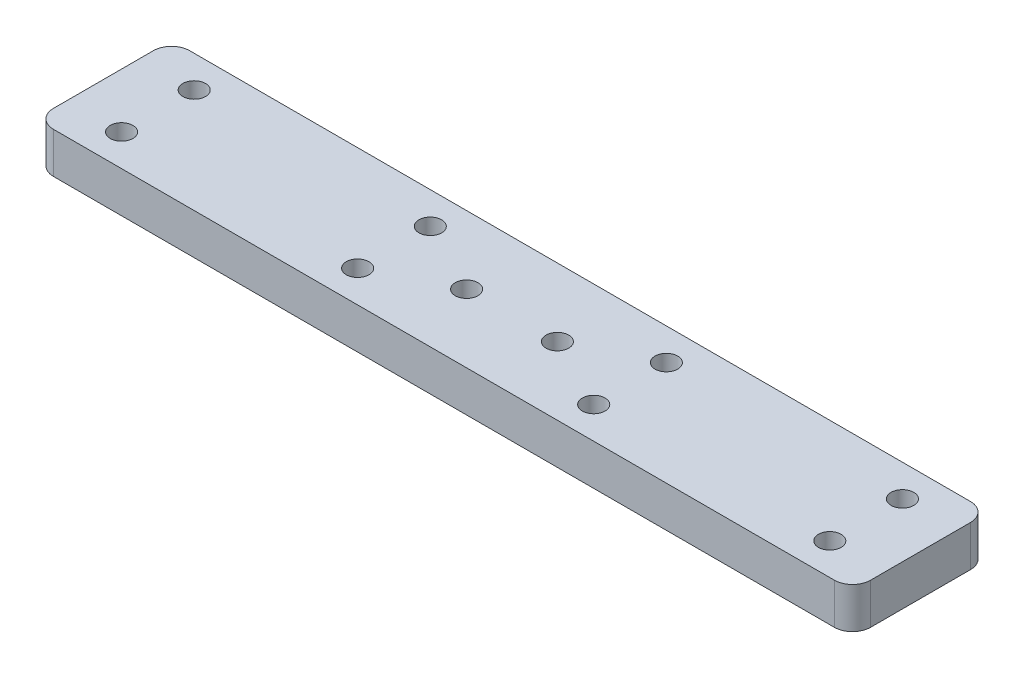
ISO-10303-21;
HEADER;
FILE_DESCRIPTION(('STEP AP214'),'2;1');
FILE_NAME('part.step','',(''),(''),'','','');
FILE_SCHEMA(('AUTOMOTIVE_DESIGN { 1 0 10303 214 1 1 1 1 }'));
ENDSEC;
DATA;
#1=APPLICATION_CONTEXT('core data for automotive mechanical design processes');
#2=APPLICATION_PROTOCOL_DEFINITION('international standard','automotive_design',2000,#1);
#3=PRODUCT_CONTEXT('',#1,'mechanical');
#4=PRODUCT('Part','Part','',(#3));
#5=PRODUCT_RELATED_PRODUCT_CATEGORY('part','',(#4));
#6=PRODUCT_DEFINITION_FORMATION('','',#4);
#7=PRODUCT_DEFINITION_CONTEXT('part definition',#1,'design');
#8=PRODUCT_DEFINITION('design','',#6,#7);
#9=PRODUCT_DEFINITION_SHAPE('','',#8);
#10=(LENGTH_UNIT() NAMED_UNIT(*) SI_UNIT(.MILLI.,.METRE.));
#11=(NAMED_UNIT(*) PLANE_ANGLE_UNIT() SI_UNIT($,.RADIAN.));
#12=(NAMED_UNIT(*) SI_UNIT($,.STERADIAN.) SOLID_ANGLE_UNIT());
#13=UNCERTAINTY_MEASURE_WITH_UNIT(LENGTH_MEASURE(1.E-05),#10,'distance_accuracy_value','');
#14=(GEOMETRIC_REPRESENTATION_CONTEXT(3) GLOBAL_UNCERTAINTY_ASSIGNED_CONTEXT((#13)) GLOBAL_UNIT_ASSIGNED_CONTEXT((#10,
#11,#12)) REPRESENTATION_CONTEXT('',''));
#15=CARTESIAN_POINT('',(0.,0.,0.));
#16=DIRECTION('',(0.,0.,1.));
#17=DIRECTION('',(1.,0.,0.));
#18=AXIS2_PLACEMENT_3D('',#15,#16,#17);
#19=CARTESIAN_POINT('',(43.,4.5,-5.5));
#20=DIRECTION('',(0.,1.,0.));
#21=DIRECTION('',(0.,0.,1.));
#22=AXIS2_PLACEMENT_3D('',#19,#20,#21);
#23=PLANE('',#22);
#24=CARTESIAN_POINT('',(39.,4.5,-3.99999999999999));
#25=DIRECTION('',(0.,1.,0.));
#26=DIRECTION('',(0.,0.,1.));
#27=AXIS2_PLACEMENT_3D('',#24,#25,#26);
#28=CIRCLE('',#27,1.25);
#29=CARTESIAN_POINT('',(39.,4.5,-2.75));
#30=VERTEX_POINT('',#29);
#31=EDGE_CURVE('E228',#30,#30,#28,.T.);
#32=ORIENTED_EDGE('',*,*,#31,.F.);
#33=EDGE_LOOP('',(#32));
#34=FACE_BOUND('',#33,.T.);
#35=CARTESIAN_POINT('',(13.,4.5,-3.99999999999999));
#36=DIRECTION('',(0.,1.,0.));
#37=DIRECTION('',(0.,0.,1.));
#38=AXIS2_PLACEMENT_3D('',#35,#36,#37);
#39=CIRCLE('',#38,1.25);
#40=CARTESIAN_POINT('',(13.,4.5,-2.75));
#41=VERTEX_POINT('',#40);
#42=EDGE_CURVE('E216',#41,#41,#39,.T.);
#43=ORIENTED_EDGE('',*,*,#42,.F.);
#44=EDGE_LOOP('',(#43));
#45=FACE_BOUND('',#44,.T.);
#46=CARTESIAN_POINT('',(-39.,4.5,4.00000000000001));
#47=DIRECTION('',(0.,1.,0.));
#48=DIRECTION('',(0.,0.,1.));
#49=AXIS2_PLACEMENT_3D('',#46,#47,#48);
#50=CIRCLE('',#49,1.25);
#51=CARTESIAN_POINT('',(-39.,4.5,5.25));
#52=VERTEX_POINT('',#51);
#53=EDGE_CURVE('E204',#52,#52,#50,.T.);
#54=ORIENTED_EDGE('',*,*,#53,.F.);
#55=EDGE_LOOP('',(#54));
#56=FACE_BOUND('',#55,.T.);
#57=CARTESIAN_POINT('',(5.,4.5,0.));
#58=DIRECTION('',(0.,1.,0.));
#59=DIRECTION('',(0.,0.,1.));
#60=AXIS2_PLACEMENT_3D('',#57,#58,#59);
#61=CIRCLE('',#60,1.25);
#62=CARTESIAN_POINT('',(5.,4.5,1.25));
#63=VERTEX_POINT('',#62);
#64=EDGE_CURVE('E192',#63,#63,#61,.T.);
#65=ORIENTED_EDGE('',*,*,#64,.F.);
#66=EDGE_LOOP('',(#65));
#67=FACE_BOUND('',#66,.T.);
#68=CARTESIAN_POINT('',(-5.,4.5,0.));
#69=DIRECTION('',(0.,1.,0.));
#70=DIRECTION('',(0.,0.,1.));
#71=AXIS2_PLACEMENT_3D('',#68,#69,#70);
#72=CIRCLE('',#71,1.25);
#73=CARTESIAN_POINT('',(-5.,4.5,1.25));
#74=VERTEX_POINT('',#73);
#75=EDGE_CURVE('E138',#74,#74,#72,.T.);
#76=ORIENTED_EDGE('',*,*,#75,.F.);
#77=EDGE_LOOP('',(#76));
#78=FACE_BOUND('',#77,.T.);
#79=CARTESIAN_POINT('',(43.,4.5,-5.5));
#80=DIRECTION('',(0.,1.,0.));
#81=DIRECTION('',(0.,0.,1.));
#82=AXIS2_PLACEMENT_3D('',#79,#80,#81);
#83=CIRCLE('',#82,2.);
#84=CARTESIAN_POINT('',(45.,4.5,-5.49999999999999));
#85=VERTEX_POINT('',#84);
#86=CARTESIAN_POINT('',(43.,4.5,-7.5));
#87=VERTEX_POINT('',#86);
#88=EDGE_CURVE('E149',#85,#87,#83,.T.);
#89=ORIENTED_EDGE('',*,*,#88,.T.);
#90=DIRECTION('',(-1.,0.,0.));
#91=VECTOR('',#90,1.);
#92=CARTESIAN_POINT('',(-43.,4.5,-7.5));
#93=LINE('',#92,#91);
#94=CARTESIAN_POINT('',(-43.,4.5,-7.5));
#95=VERTEX_POINT('',#94);
#96=EDGE_CURVE('E97',#87,#95,#93,.T.);
#97=ORIENTED_EDGE('',*,*,#96,.T.);
#98=CARTESIAN_POINT('',(-43.,4.5,-5.5));
#99=DIRECTION('',(0.,1.,0.));
#100=DIRECTION('',(0.,0.,-1.));
#101=AXIS2_PLACEMENT_3D('',#98,#99,#100);
#102=CIRCLE('',#101,2.);
#103=CARTESIAN_POINT('',(-45.,4.5,-5.49999999999999));
#104=VERTEX_POINT('',#103);
#105=EDGE_CURVE('E164',#95,#104,#102,.T.);
#106=ORIENTED_EDGE('',*,*,#105,.T.);
#107=DIRECTION('',(0.,0.,1.));
#108=VECTOR('',#107,1.);
#109=CARTESIAN_POINT('',(-45.,4.5,-5.49999999999999));
#110=LINE('',#109,#108);
#111=CARTESIAN_POINT('',(-45.,4.5,5.49999999999998));
#112=VERTEX_POINT('',#111);
#113=EDGE_CURVE('E177',#104,#112,#110,.T.);
#114=ORIENTED_EDGE('',*,*,#113,.T.);
#115=CARTESIAN_POINT('',(-43.,4.5,5.5));
#116=DIRECTION('',(0.,1.,0.));
#117=DIRECTION('',(0.,0.,1.));
#118=AXIS2_PLACEMENT_3D('',#115,#116,#117);
#119=CIRCLE('',#118,2.);
#120=CARTESIAN_POINT('',(-43.,4.5,7.5));
#121=VERTEX_POINT('',#120);
#122=EDGE_CURVE('E116',#112,#121,#119,.T.);
#123=ORIENTED_EDGE('',*,*,#122,.T.);
#124=DIRECTION('',(1.,0.,0.));
#125=VECTOR('',#124,1.);
#126=CARTESIAN_POINT('',(-43.,4.5,7.5));
#127=LINE('',#126,#125);
#128=CARTESIAN_POINT('',(43.,4.5,7.5));
#129=VERTEX_POINT('',#128);
#130=EDGE_CURVE('E110',#121,#129,#127,.T.);
#131=ORIENTED_EDGE('',*,*,#130,.T.);
#132=CARTESIAN_POINT('',(43.,4.5,5.5));
#133=DIRECTION('',(0.,1.,0.));
#134=DIRECTION('',(0.,0.,-1.));
#135=AXIS2_PLACEMENT_3D('',#132,#133,#134);
#136=CIRCLE('',#135,2.);
#137=CARTESIAN_POINT('',(45.,4.5,5.49999999999999));
#138=VERTEX_POINT('',#137);
#139=EDGE_CURVE('E114',#129,#138,#136,.T.);
#140=ORIENTED_EDGE('',*,*,#139,.T.);
#141=DIRECTION('',(0.,0.,-1.));
#142=VECTOR('',#141,1.);
#143=CARTESIAN_POINT('',(45.,4.5,-5.49999999999999));
#144=LINE('',#143,#142);
#145=EDGE_CURVE('E54',#138,#85,#144,.T.);
#146=ORIENTED_EDGE('',*,*,#145,.T.);
#147=EDGE_LOOP('',(#89,#97,#106,#114,#123,#131,#140,#146));
#148=FACE_BOUND('',#147,.T.);
#149=CARTESIAN_POINT('',(-39.,4.5,-3.99999999999999));
#150=DIRECTION('',(0.,1.,0.));
#151=DIRECTION('',(0.,0.,1.));
#152=AXIS2_PLACEMENT_3D('',#149,#150,#151);
#153=CIRCLE('',#152,1.25);
#154=CARTESIAN_POINT('',(-39.,4.5,-2.75));
#155=VERTEX_POINT('',#154);
#156=EDGE_CURVE('E186',#155,#155,#153,.T.);
#157=ORIENTED_EDGE('',*,*,#156,.F.);
#158=EDGE_LOOP('',(#157));
#159=FACE_BOUND('',#158,.T.);
#160=CARTESIAN_POINT('',(-13.,4.5,-3.99999999999999));
#161=DIRECTION('',(0.,1.,0.));
#162=DIRECTION('',(0.,0.,1.));
#163=AXIS2_PLACEMENT_3D('',#160,#161,#162);
#164=CIRCLE('',#163,1.25);
#165=CARTESIAN_POINT('',(-13.,4.5,-2.75));
#166=VERTEX_POINT('',#165);
#167=EDGE_CURVE('E198',#166,#166,#164,.T.);
#168=ORIENTED_EDGE('',*,*,#167,.F.);
#169=EDGE_LOOP('',(#168));
#170=FACE_BOUND('',#169,.T.);
#171=CARTESIAN_POINT('',(-13.,4.5,4.00000000000001));
#172=DIRECTION('',(0.,1.,0.));
#173=DIRECTION('',(0.,0.,1.));
#174=AXIS2_PLACEMENT_3D('',#171,#172,#173);
#175=CIRCLE('',#174,1.25);
#176=CARTESIAN_POINT('',(-13.,4.5,5.25));
#177=VERTEX_POINT('',#176);
#178=EDGE_CURVE('E210',#177,#177,#175,.T.);
#179=ORIENTED_EDGE('',*,*,#178,.F.);
#180=EDGE_LOOP('',(#179));
#181=FACE_BOUND('',#180,.T.);
#182=CARTESIAN_POINT('',(13.,4.5,4.00000000000001));
#183=DIRECTION('',(0.,1.,0.));
#184=DIRECTION('',(0.,0.,1.));
#185=AXIS2_PLACEMENT_3D('',#182,#183,#184);
#186=CIRCLE('',#185,1.25);
#187=CARTESIAN_POINT('',(13.,4.5,5.25));
#188=VERTEX_POINT('',#187);
#189=EDGE_CURVE('E222',#188,#188,#186,.T.);
#190=ORIENTED_EDGE('',*,*,#189,.F.);
#191=EDGE_LOOP('',(#190));
#192=FACE_BOUND('',#191,.T.);
#193=CARTESIAN_POINT('',(39.,4.5,4.00000000000001));
#194=DIRECTION('',(0.,1.,0.));
#195=DIRECTION('',(0.,0.,1.));
#196=AXIS2_PLACEMENT_3D('',#193,#194,#195);
#197=CIRCLE('',#196,1.25);
#198=CARTESIAN_POINT('',(39.,4.5,5.25));
#199=VERTEX_POINT('',#198);
#200=EDGE_CURVE('E234',#199,#199,#197,.T.);
#201=ORIENTED_EDGE('',*,*,#200,.F.);
#202=EDGE_LOOP('',(#201));
#203=FACE_BOUND('',#202,.T.);
#204=ADVANCED_FACE('F37',(#34,#45,#56,#67,#78,#148,#159,#170,#181,#192,#203),#23,.T.);
#205=CARTESIAN_POINT('',(43.,0.,-5.5));
#206=DIRECTION('',(0.,1.,0.));
#207=DIRECTION('',(0.,0.,1.));
#208=AXIS2_PLACEMENT_3D('',#205,#206,#207);
#209=PLANE('',#208);
#210=CARTESIAN_POINT('',(43.,0.,-5.5));
#211=DIRECTION('',(0.,1.,0.));
#212=DIRECTION('',(0.,0.,1.));
#213=AXIS2_PLACEMENT_3D('',#210,#211,#212);
#214=CIRCLE('',#213,2.);
#215=CARTESIAN_POINT('',(45.,0.,-5.49999999999999));
#216=VERTEX_POINT('',#215);
#217=CARTESIAN_POINT('',(43.,0.,-7.5));
#218=VERTEX_POINT('',#217);
#219=EDGE_CURVE('E134',#216,#218,#214,.T.);
#220=ORIENTED_EDGE('',*,*,#219,.F.);
#221=DIRECTION('',(0.,0.,-1.));
#222=VECTOR('',#221,1.);
#223=CARTESIAN_POINT('',(45.,0.,-5.49999999999999));
#224=LINE('',#223,#222);
#225=CARTESIAN_POINT('',(45.,0.,5.49999999999999));
#226=VERTEX_POINT('',#225);
#227=EDGE_CURVE('E89',#226,#216,#224,.T.);
#228=ORIENTED_EDGE('',*,*,#227,.F.);
#229=CARTESIAN_POINT('',(43.,0.,5.5));
#230=DIRECTION('',(0.,1.,0.));
#231=DIRECTION('',(0.,0.,-1.));
#232=AXIS2_PLACEMENT_3D('',#229,#230,#231);
#233=CIRCLE('',#232,2.);
#234=CARTESIAN_POINT('',(43.,0.,7.5));
#235=VERTEX_POINT('',#234);
#236=EDGE_CURVE('E83',#235,#226,#233,.T.);
#237=ORIENTED_EDGE('',*,*,#236,.F.);
#238=DIRECTION('',(1.,0.,0.));
#239=VECTOR('',#238,1.);
#240=CARTESIAN_POINT('',(-43.,0.,7.5));
#241=LINE('',#240,#239);
#242=CARTESIAN_POINT('',(-43.,0.,7.5));
#243=VERTEX_POINT('',#242);
#244=EDGE_CURVE('E124',#243,#235,#241,.T.);
#245=ORIENTED_EDGE('',*,*,#244,.F.);
#246=CARTESIAN_POINT('',(-43.,0.,5.5));
#247=DIRECTION('',(0.,1.,0.));
#248=DIRECTION('',(0.,0.,1.));
#249=AXIS2_PLACEMENT_3D('',#246,#247,#248);
#250=CIRCLE('',#249,2.);
#251=CARTESIAN_POINT('',(-45.,0.,5.49999999999998));
#252=VERTEX_POINT('',#251);
#253=EDGE_CURVE('E144',#252,#243,#250,.T.);
#254=ORIENTED_EDGE('',*,*,#253,.F.);
#255=DIRECTION('',(0.,0.,1.));
#256=VECTOR('',#255,1.);
#257=CARTESIAN_POINT('',(-45.,0.,-5.49999999999999));
#258=LINE('',#257,#256);
#259=CARTESIAN_POINT('',(-45.,0.,-5.49999999999999));
#260=VERTEX_POINT('',#259);
#261=EDGE_CURVE('E142',#260,#252,#258,.T.);
#262=ORIENTED_EDGE('',*,*,#261,.F.);
#263=CARTESIAN_POINT('',(-43.,0.,-5.5));
#264=DIRECTION('',(0.,1.,0.));
#265=DIRECTION('',(0.,0.,-1.));
#266=AXIS2_PLACEMENT_3D('',#263,#264,#265);
#267=CIRCLE('',#266,2.);
#268=CARTESIAN_POINT('',(-43.,0.,-7.5));
#269=VERTEX_POINT('',#268);
#270=EDGE_CURVE('E140',#269,#260,#267,.T.);
#271=ORIENTED_EDGE('',*,*,#270,.F.);
#272=DIRECTION('',(-1.,0.,0.));
#273=VECTOR('',#272,1.);
#274=CARTESIAN_POINT('',(-43.,0.,-7.5));
#275=LINE('',#274,#273);
#276=EDGE_CURVE('E137',#218,#269,#275,.T.);
#277=ORIENTED_EDGE('',*,*,#276,.F.);
#278=EDGE_LOOP('',(#220,#228,#237,#245,#254,#262,#271,#277));
#279=FACE_BOUND('',#278,.T.);
#280=CARTESIAN_POINT('',(-5.,0.,0.));
#281=DIRECTION('',(0.,1.,0.));
#282=DIRECTION('',(0.,0.,1.));
#283=AXIS2_PLACEMENT_3D('',#280,#281,#282);
#284=CIRCLE('',#283,1.25);
#285=CARTESIAN_POINT('',(-5.,0.,1.25));
#286=VERTEX_POINT('',#285);
#287=EDGE_CURVE('E183',#286,#286,#284,.T.);
#288=ORIENTED_EDGE('',*,*,#287,.T.);
#289=EDGE_LOOP('',(#288));
#290=FACE_BOUND('',#289,.T.);
#291=CARTESIAN_POINT('',(-39.,0.,-3.99999999999999));
#292=DIRECTION('',(0.,1.,0.));
#293=DIRECTION('',(0.,0.,1.));
#294=AXIS2_PLACEMENT_3D('',#291,#292,#293);
#295=CIRCLE('',#294,1.25);
#296=CARTESIAN_POINT('',(-39.,0.,-2.75));
#297=VERTEX_POINT('',#296);
#298=EDGE_CURVE('E189',#297,#297,#295,.T.);
#299=ORIENTED_EDGE('',*,*,#298,.T.);
#300=EDGE_LOOP('',(#299));
#301=FACE_BOUND('',#300,.T.);
#302=CARTESIAN_POINT('',(5.,0.,0.));
#303=DIRECTION('',(0.,1.,0.));
#304=DIRECTION('',(0.,0.,1.));
#305=AXIS2_PLACEMENT_3D('',#302,#303,#304);
#306=CIRCLE('',#305,1.25);
#307=CARTESIAN_POINT('',(5.,0.,1.25));
#308=VERTEX_POINT('',#307);
#309=EDGE_CURVE('E195',#308,#308,#306,.T.);
#310=ORIENTED_EDGE('',*,*,#309,.T.);
#311=EDGE_LOOP('',(#310));
#312=FACE_BOUND('',#311,.T.);
#313=CARTESIAN_POINT('',(-13.,0.,-3.99999999999999));
#314=DIRECTION('',(0.,1.,0.));
#315=DIRECTION('',(0.,0.,1.));
#316=AXIS2_PLACEMENT_3D('',#313,#314,#315);
#317=CIRCLE('',#316,1.25);
#318=CARTESIAN_POINT('',(-13.,0.,-2.75));
#319=VERTEX_POINT('',#318);
#320=EDGE_CURVE('E201',#319,#319,#317,.T.);
#321=ORIENTED_EDGE('',*,*,#320,.T.);
#322=EDGE_LOOP('',(#321));
#323=FACE_BOUND('',#322,.T.);
#324=CARTESIAN_POINT('',(-39.,0.,4.00000000000001));
#325=DIRECTION('',(0.,1.,0.));
#326=DIRECTION('',(0.,0.,1.));
#327=AXIS2_PLACEMENT_3D('',#324,#325,#326);
#328=CIRCLE('',#327,1.25);
#329=CARTESIAN_POINT('',(-39.,0.,5.25));
#330=VERTEX_POINT('',#329);
#331=EDGE_CURVE('E207',#330,#330,#328,.T.);
#332=ORIENTED_EDGE('',*,*,#331,.T.);
#333=EDGE_LOOP('',(#332));
#334=FACE_BOUND('',#333,.T.);
#335=CARTESIAN_POINT('',(-13.,0.,4.00000000000001));
#336=DIRECTION('',(0.,1.,0.));
#337=DIRECTION('',(0.,0.,1.));
#338=AXIS2_PLACEMENT_3D('',#335,#336,#337);
#339=CIRCLE('',#338,1.25);
#340=CARTESIAN_POINT('',(-13.,0.,5.25));
#341=VERTEX_POINT('',#340);
#342=EDGE_CURVE('E213',#341,#341,#339,.T.);
#343=ORIENTED_EDGE('',*,*,#342,.T.);
#344=EDGE_LOOP('',(#343));
#345=FACE_BOUND('',#344,.T.);
#346=CARTESIAN_POINT('',(13.,0.,-3.99999999999999));
#347=DIRECTION('',(0.,1.,0.));
#348=DIRECTION('',(0.,0.,1.));
#349=AXIS2_PLACEMENT_3D('',#346,#347,#348);
#350=CIRCLE('',#349,1.25);
#351=CARTESIAN_POINT('',(13.,0.,-2.75));
#352=VERTEX_POINT('',#351);
#353=EDGE_CURVE('E219',#352,#352,#350,.T.);
#354=ORIENTED_EDGE('',*,*,#353,.T.);
#355=EDGE_LOOP('',(#354));
#356=FACE_BOUND('',#355,.T.);
#357=CARTESIAN_POINT('',(13.,0.,4.00000000000001));
#358=DIRECTION('',(0.,1.,0.));
#359=DIRECTION('',(0.,0.,1.));
#360=AXIS2_PLACEMENT_3D('',#357,#358,#359);
#361=CIRCLE('',#360,1.25);
#362=CARTESIAN_POINT('',(13.,0.,5.25));
#363=VERTEX_POINT('',#362);
#364=EDGE_CURVE('E225',#363,#363,#361,.T.);
#365=ORIENTED_EDGE('',*,*,#364,.T.);
#366=EDGE_LOOP('',(#365));
#367=FACE_BOUND('',#366,.T.);
#368=CARTESIAN_POINT('',(39.,0.,-3.99999999999999));
#369=DIRECTION('',(0.,1.,0.));
#370=DIRECTION('',(0.,0.,1.));
#371=AXIS2_PLACEMENT_3D('',#368,#369,#370);
#372=CIRCLE('',#371,1.25);
#373=CARTESIAN_POINT('',(39.,0.,-2.75));
#374=VERTEX_POINT('',#373);
#375=EDGE_CURVE('E231',#374,#374,#372,.T.);
#376=ORIENTED_EDGE('',*,*,#375,.T.);
#377=EDGE_LOOP('',(#376));
#378=FACE_BOUND('',#377,.T.);
#379=CARTESIAN_POINT('',(39.,0.,4.00000000000001));
#380=DIRECTION('',(0.,1.,0.));
#381=DIRECTION('',(0.,0.,1.));
#382=AXIS2_PLACEMENT_3D('',#379,#380,#381);
#383=CIRCLE('',#382,1.25);
#384=CARTESIAN_POINT('',(39.,0.,5.25));
#385=VERTEX_POINT('',#384);
#386=EDGE_CURVE('E237',#385,#385,#383,.T.);
#387=ORIENTED_EDGE('',*,*,#386,.T.);
#388=EDGE_LOOP('',(#387));
#389=FACE_BOUND('',#388,.T.);
#390=ADVANCED_FACE('F168',(#279,#290,#301,#312,#323,#334,#345,#356,#367,#378,#389),#209,.F.);
#391=CARTESIAN_POINT('',(43.,4.5,-5.5));
#392=DIRECTION('',(0.,-1.,0.));
#393=DIRECTION('',(0.,0.,-1.));
#394=AXIS2_PLACEMENT_3D('',#391,#392,#393);
#395=CYLINDRICAL_SURFACE('',#394,2.);
#396=ORIENTED_EDGE('',*,*,#219,.T.);
#397=DIRECTION('',(0.,-1.,0.));
#398=VECTOR('',#397,1.);
#399=CARTESIAN_POINT('',(43.,4.5,-7.5));
#400=LINE('',#399,#398);
#401=EDGE_CURVE('E11',#87,#218,#400,.T.);
#402=ORIENTED_EDGE('',*,*,#401,.F.);
#403=ORIENTED_EDGE('',*,*,#88,.F.);
#404=DIRECTION('',(0.,-1.,0.));
#405=VECTOR('',#404,1.);
#406=CARTESIAN_POINT('',(45.,4.5,-5.49999999999999));
#407=LINE('',#406,#405);
#408=EDGE_CURVE('E130',#85,#216,#407,.T.);
#409=ORIENTED_EDGE('',*,*,#408,.T.);
#410=EDGE_LOOP('',(#396,#402,#403,#409));
#411=FACE_BOUND('',#410,.T.);
#412=ADVANCED_FACE('F39',(#411),#395,.T.);
#413=CARTESIAN_POINT('',(-43.,4.5,-7.5));
#414=DIRECTION('',(0.,0.,1.));
#415=DIRECTION('',(1.,0.,0.));
#416=AXIS2_PLACEMENT_3D('',#413,#414,#415);
#417=PLANE('',#416);
#418=ORIENTED_EDGE('',*,*,#276,.T.);
#419=DIRECTION('',(0.,-1.,0.));
#420=VECTOR('',#419,1.);
#421=CARTESIAN_POINT('',(-43.,4.5,-7.5));
#422=LINE('',#421,#420);
#423=EDGE_CURVE('E46',#95,#269,#422,.T.);
#424=ORIENTED_EDGE('',*,*,#423,.F.);
#425=ORIENTED_EDGE('',*,*,#96,.F.);
#426=ORIENTED_EDGE('',*,*,#401,.T.);
#427=EDGE_LOOP('',(#418,#424,#425,#426));
#428=FACE_BOUND('',#427,.T.);
#429=ADVANCED_FACE('F271',(#428),#417,.F.);
#430=CARTESIAN_POINT('',(-43.,4.5,-5.5));
#431=DIRECTION('',(0.,-1.,0.));
#432=DIRECTION('',(0.,0.,-1.));
#433=AXIS2_PLACEMENT_3D('',#430,#431,#432);
#434=CYLINDRICAL_SURFACE('',#433,2.);
#435=ORIENTED_EDGE('',*,*,#270,.T.);
#436=DIRECTION('',(0.,-1.,0.));
#437=VECTOR('',#436,1.);
#438=CARTESIAN_POINT('',(-45.,4.5,-5.49999999999999));
#439=LINE('',#438,#437);
#440=EDGE_CURVE('E156',#104,#260,#439,.T.);
#441=ORIENTED_EDGE('',*,*,#440,.F.);
#442=ORIENTED_EDGE('',*,*,#105,.F.);
#443=ORIENTED_EDGE('',*,*,#423,.T.);
#444=EDGE_LOOP('',(#435,#441,#442,#443));
#445=FACE_BOUND('',#444,.T.);
#446=ADVANCED_FACE('F162',(#445),#434,.T.);
#447=CARTESIAN_POINT('',(-45.,4.5,-5.49999999999999));
#448=DIRECTION('',(1.,0.,0.));
#449=DIRECTION('',(0.,0.,-1.));
#450=AXIS2_PLACEMENT_3D('',#447,#448,#449);
#451=PLANE('',#450);
#452=ORIENTED_EDGE('',*,*,#261,.T.);
#453=DIRECTION('',(0.,-1.,0.));
#454=VECTOR('',#453,1.);
#455=CARTESIAN_POINT('',(-45.,4.5,5.49999999999998));
#456=LINE('',#455,#454);
#457=EDGE_CURVE('E153',#112,#252,#456,.T.);
#458=ORIENTED_EDGE('',*,*,#457,.F.);
#459=ORIENTED_EDGE('',*,*,#113,.F.);
#460=ORIENTED_EDGE('',*,*,#440,.T.);
#461=EDGE_LOOP('',(#452,#458,#459,#460));
#462=FACE_BOUND('',#461,.T.);
#463=ADVANCED_FACE('F173',(#462),#451,.F.);
#464=CARTESIAN_POINT('',(-43.,4.5,5.5));
#465=DIRECTION('',(0.,-1.,0.));
#466=DIRECTION('',(0.,0.,-1.));
#467=AXIS2_PLACEMENT_3D('',#464,#465,#466);
#468=CYLINDRICAL_SURFACE('',#467,2.);
#469=ORIENTED_EDGE('',*,*,#253,.T.);
#470=DIRECTION('',(0.,-1.,0.));
#471=VECTOR('',#470,1.);
#472=CARTESIAN_POINT('',(-43.,4.5,7.5));
#473=LINE('',#472,#471);
#474=EDGE_CURVE('E125',#121,#243,#473,.T.);
#475=ORIENTED_EDGE('',*,*,#474,.F.);
#476=ORIENTED_EDGE('',*,*,#122,.F.);
#477=ORIENTED_EDGE('',*,*,#457,.T.);
#478=EDGE_LOOP('',(#469,#475,#476,#477));
#479=FACE_BOUND('',#478,.T.);
#480=ADVANCED_FACE('F176',(#479),#468,.T.);
#481=CARTESIAN_POINT('',(-43.,4.5,7.5));
#482=DIRECTION('',(0.,0.,-1.));
#483=DIRECTION('',(-1.,0.,0.));
#484=AXIS2_PLACEMENT_3D('',#481,#482,#483);
#485=PLANE('',#484);
#486=ORIENTED_EDGE('',*,*,#244,.T.);
#487=DIRECTION('',(0.,-1.,0.));
#488=VECTOR('',#487,1.);
#489=CARTESIAN_POINT('',(43.,4.5,7.5));
#490=LINE('',#489,#488);
#491=EDGE_CURVE('E121',#129,#235,#490,.T.);
#492=ORIENTED_EDGE('',*,*,#491,.F.);
#493=ORIENTED_EDGE('',*,*,#130,.F.);
#494=ORIENTED_EDGE('',*,*,#474,.T.);
#495=EDGE_LOOP('',(#486,#492,#493,#494));
#496=FACE_BOUND('',#495,.T.);
#497=ADVANCED_FACE('F122',(#496),#485,.F.);
#498=CARTESIAN_POINT('',(43.,4.5,5.5));
#499=DIRECTION('',(0.,-1.,0.));
#500=DIRECTION('',(0.,0.,-1.));
#501=AXIS2_PLACEMENT_3D('',#498,#499,#500);
#502=CYLINDRICAL_SURFACE('',#501,2.);
#503=ORIENTED_EDGE('',*,*,#236,.T.);
#504=DIRECTION('',(0.,-1.,0.));
#505=VECTOR('',#504,1.);
#506=CARTESIAN_POINT('',(45.,4.5,5.49999999999999));
#507=LINE('',#506,#505);
#508=EDGE_CURVE('E126',#138,#226,#507,.T.);
#509=ORIENTED_EDGE('',*,*,#508,.F.);
#510=ORIENTED_EDGE('',*,*,#139,.F.);
#511=ORIENTED_EDGE('',*,*,#491,.T.);
#512=EDGE_LOOP('',(#503,#509,#510,#511));
#513=FACE_BOUND('',#512,.T.);
#514=ADVANCED_FACE('F128',(#513),#502,.T.);
#515=CARTESIAN_POINT('',(45.,4.5,-5.49999999999999));
#516=DIRECTION('',(-1.,0.,0.));
#517=DIRECTION('',(0.,0.,1.));
#518=AXIS2_PLACEMENT_3D('',#515,#516,#517);
#519=PLANE('',#518);
#520=ORIENTED_EDGE('',*,*,#227,.T.);
#521=ORIENTED_EDGE('',*,*,#408,.F.);
#522=ORIENTED_EDGE('',*,*,#145,.F.);
#523=ORIENTED_EDGE('',*,*,#508,.T.);
#524=EDGE_LOOP('',(#520,#521,#522,#523));
#525=FACE_BOUND('',#524,.T.);
#526=ADVANCED_FACE('F259',(#525),#519,.F.);
#527=CARTESIAN_POINT('',(-5.,4.5,0.));
#528=DIRECTION('',(0.,-1.,0.));
#529=DIRECTION('',(0.,0.,-1.));
#530=AXIS2_PLACEMENT_3D('',#527,#528,#529);
#531=CYLINDRICAL_SURFACE('',#530,1.25);
#532=ORIENTED_EDGE('',*,*,#75,.T.);
#533=EDGE_LOOP('',(#532));
#534=FACE_BOUND('',#533,.T.);
#535=ORIENTED_EDGE('',*,*,#287,.F.);
#536=EDGE_LOOP('',(#535));
#537=FACE_BOUND('',#536,.T.);
#538=ADVANCED_FACE('F256',(#534,#537),#531,.F.);
#539=CARTESIAN_POINT('',(-39.,4.5,-3.99999999999999));
#540=DIRECTION('',(0.,-1.,0.));
#541=DIRECTION('',(0.,0.,-1.));
#542=AXIS2_PLACEMENT_3D('',#539,#540,#541);
#543=CYLINDRICAL_SURFACE('',#542,1.25);
#544=ORIENTED_EDGE('',*,*,#156,.T.);
#545=EDGE_LOOP('',(#544));
#546=FACE_BOUND('',#545,.T.);
#547=ORIENTED_EDGE('',*,*,#298,.F.);
#548=EDGE_LOOP('',(#547));
#549=FACE_BOUND('',#548,.T.);
#550=ADVANCED_FACE('F335',(#546,#549),#543,.F.);
#551=CARTESIAN_POINT('',(5.,4.5,0.));
#552=DIRECTION('',(0.,-1.,0.));
#553=DIRECTION('',(0.,0.,-1.));
#554=AXIS2_PLACEMENT_3D('',#551,#552,#553);
#555=CYLINDRICAL_SURFACE('',#554,1.25);
#556=ORIENTED_EDGE('',*,*,#64,.T.);
#557=EDGE_LOOP('',(#556));
#558=FACE_BOUND('',#557,.T.);
#559=ORIENTED_EDGE('',*,*,#309,.F.);
#560=EDGE_LOOP('',(#559));
#561=FACE_BOUND('',#560,.T.);
#562=ADVANCED_FACE('F343',(#558,#561),#555,.F.);
#563=CARTESIAN_POINT('',(-13.,4.5,-3.99999999999999));
#564=DIRECTION('',(0.,-1.,0.));
#565=DIRECTION('',(0.,0.,-1.));
#566=AXIS2_PLACEMENT_3D('',#563,#564,#565);
#567=CYLINDRICAL_SURFACE('',#566,1.25);
#568=ORIENTED_EDGE('',*,*,#167,.T.);
#569=EDGE_LOOP('',(#568));
#570=FACE_BOUND('',#569,.T.);
#571=ORIENTED_EDGE('',*,*,#320,.F.);
#572=EDGE_LOOP('',(#571));
#573=FACE_BOUND('',#572,.T.);
#574=ADVANCED_FACE('F351',(#570,#573),#567,.F.);
#575=CARTESIAN_POINT('',(-39.,4.5,4.00000000000001));
#576=DIRECTION('',(0.,-1.,0.));
#577=DIRECTION('',(0.,0.,-1.));
#578=AXIS2_PLACEMENT_3D('',#575,#576,#577);
#579=CYLINDRICAL_SURFACE('',#578,1.25);
#580=ORIENTED_EDGE('',*,*,#53,.T.);
#581=EDGE_LOOP('',(#580));
#582=FACE_BOUND('',#581,.T.);
#583=ORIENTED_EDGE('',*,*,#331,.F.);
#584=EDGE_LOOP('',(#583));
#585=FACE_BOUND('',#584,.T.);
#586=ADVANCED_FACE('F360',(#582,#585),#579,.F.);
#587=CARTESIAN_POINT('',(-13.,4.5,4.00000000000001));
#588=DIRECTION('',(0.,-1.,0.));
#589=DIRECTION('',(0.,0.,-1.));
#590=AXIS2_PLACEMENT_3D('',#587,#588,#589);
#591=CYLINDRICAL_SURFACE('',#590,1.25);
#592=ORIENTED_EDGE('',*,*,#178,.T.);
#593=EDGE_LOOP('',(#592));
#594=FACE_BOUND('',#593,.T.);
#595=ORIENTED_EDGE('',*,*,#342,.F.);
#596=EDGE_LOOP('',(#595));
#597=FACE_BOUND('',#596,.T.);
#598=ADVANCED_FACE('F369',(#594,#597),#591,.F.);
#599=CARTESIAN_POINT('',(13.,4.5,-3.99999999999999));
#600=DIRECTION('',(0.,-1.,0.));
#601=DIRECTION('',(0.,0.,-1.));
#602=AXIS2_PLACEMENT_3D('',#599,#600,#601);
#603=CYLINDRICAL_SURFACE('',#602,1.25);
#604=ORIENTED_EDGE('',*,*,#42,.T.);
#605=EDGE_LOOP('',(#604));
#606=FACE_BOUND('',#605,.T.);
#607=ORIENTED_EDGE('',*,*,#353,.F.);
#608=EDGE_LOOP('',(#607));
#609=FACE_BOUND('',#608,.T.);
#610=ADVANCED_FACE('F378',(#606,#609),#603,.F.);
#611=CARTESIAN_POINT('',(13.,4.5,4.00000000000001));
#612=DIRECTION('',(0.,-1.,0.));
#613=DIRECTION('',(0.,0.,-1.));
#614=AXIS2_PLACEMENT_3D('',#611,#612,#613);
#615=CYLINDRICAL_SURFACE('',#614,1.25);
#616=ORIENTED_EDGE('',*,*,#189,.T.);
#617=EDGE_LOOP('',(#616));
#618=FACE_BOUND('',#617,.T.);
#619=ORIENTED_EDGE('',*,*,#364,.F.);
#620=EDGE_LOOP('',(#619));
#621=FACE_BOUND('',#620,.T.);
#622=ADVANCED_FACE('F387',(#618,#621),#615,.F.);
#623=CARTESIAN_POINT('',(39.,4.5,-3.99999999999999));
#624=DIRECTION('',(0.,-1.,0.));
#625=DIRECTION('',(0.,0.,-1.));
#626=AXIS2_PLACEMENT_3D('',#623,#624,#625);
#627=CYLINDRICAL_SURFACE('',#626,1.25);
#628=ORIENTED_EDGE('',*,*,#31,.T.);
#629=EDGE_LOOP('',(#628));
#630=FACE_BOUND('',#629,.T.);
#631=ORIENTED_EDGE('',*,*,#375,.F.);
#632=EDGE_LOOP('',(#631));
#633=FACE_BOUND('',#632,.T.);
#634=ADVANCED_FACE('F396',(#630,#633),#627,.F.);
#635=CARTESIAN_POINT('',(39.,4.5,4.00000000000001));
#636=DIRECTION('',(0.,-1.,0.));
#637=DIRECTION('',(0.,0.,-1.));
#638=AXIS2_PLACEMENT_3D('',#635,#636,#637);
#639=CYLINDRICAL_SURFACE('',#638,1.25);
#640=ORIENTED_EDGE('',*,*,#200,.T.);
#641=EDGE_LOOP('',(#640));
#642=FACE_BOUND('',#641,.T.);
#643=ORIENTED_EDGE('',*,*,#386,.F.);
#644=EDGE_LOOP('',(#643));
#645=FACE_BOUND('',#644,.T.);
#646=ADVANCED_FACE('F243',(#642,#645),#639,.F.);
#647=CLOSED_SHELL('',(#204,#390,#412,#429,#446,#463,#480,#497,#514,#526,#538,#550,#562,#574,
#586,#598,#610,#622,#634,#646));
#648=MANIFOLD_SOLID_BREP('B2',#647);
#649=ADVANCED_BREP_SHAPE_REPRESENTATION('',(#18,#648),#14);
#650=SHAPE_DEFINITION_REPRESENTATION(#9,#649);
ENDSEC;
END-ISO-10303-21;
